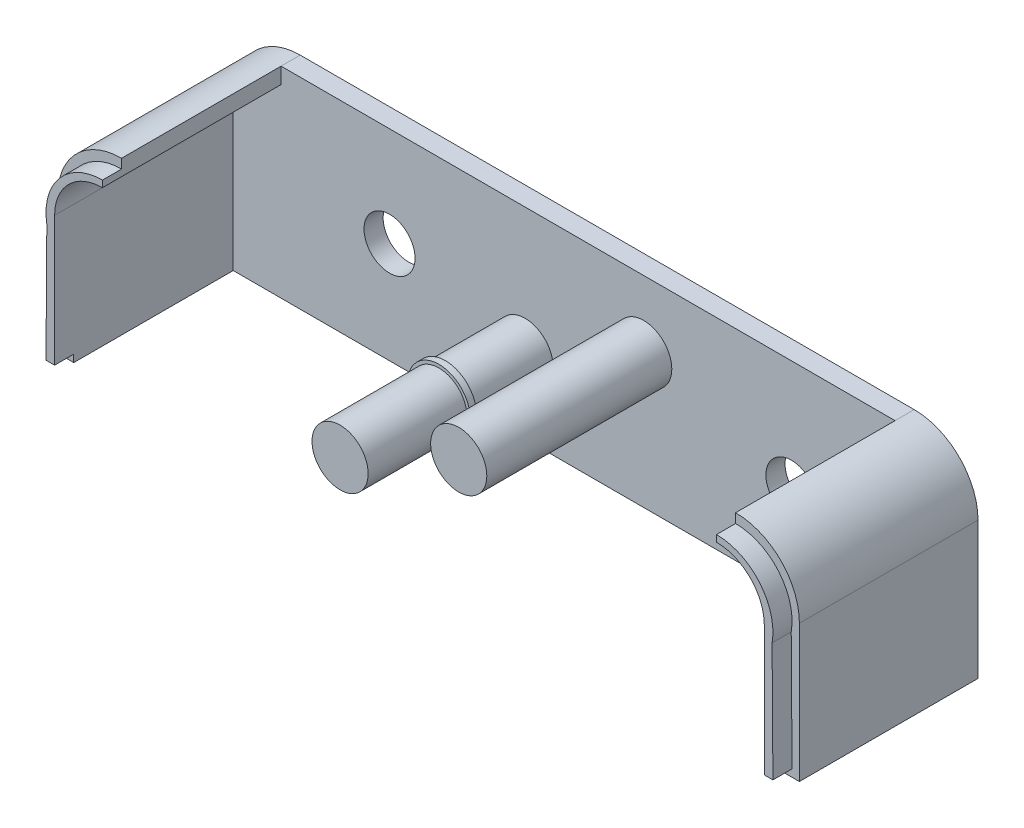
ISO-10303-21;
HEADER;
FILE_DESCRIPTION(('STEP AP214'),'2;1');
FILE_NAME('part.step','',(''),(''),'','','');
FILE_SCHEMA(('AUTOMOTIVE_DESIGN { 1 0 10303 214 1 1 1 1 }'));
ENDSEC;
DATA;
#1=APPLICATION_CONTEXT('core data for automotive mechanical design processes');
#2=APPLICATION_PROTOCOL_DEFINITION('international standard','automotive_design',2000,#1);
#3=PRODUCT_CONTEXT('',#1,'mechanical');
#4=PRODUCT('Part','Part','',(#3));
#5=PRODUCT_RELATED_PRODUCT_CATEGORY('part','',(#4));
#6=PRODUCT_DEFINITION_FORMATION('','',#4);
#7=PRODUCT_DEFINITION_CONTEXT('part definition',#1,'design');
#8=PRODUCT_DEFINITION('design','',#6,#7);
#9=PRODUCT_DEFINITION_SHAPE('','',#8);
#10=(LENGTH_UNIT() NAMED_UNIT(*) SI_UNIT(.MILLI.,.METRE.));
#11=(NAMED_UNIT(*) PLANE_ANGLE_UNIT() SI_UNIT($,.RADIAN.));
#12=(NAMED_UNIT(*) SI_UNIT($,.STERADIAN.) SOLID_ANGLE_UNIT());
#13=UNCERTAINTY_MEASURE_WITH_UNIT(LENGTH_MEASURE(1.E-05),#10,'distance_accuracy_value','');
#14=(GEOMETRIC_REPRESENTATION_CONTEXT(3) GLOBAL_UNCERTAINTY_ASSIGNED_CONTEXT((#13)) GLOBAL_UNIT_ASSIGNED_CONTEXT((#10,
#11,#12)) REPRESENTATION_CONTEXT('',''));
#15=CARTESIAN_POINT('',(0.,0.,0.));
#16=DIRECTION('',(0.,0.,1.));
#17=DIRECTION('',(1.,0.,0.));
#18=AXIS2_PLACEMENT_3D('',#15,#16,#17);
#19=CARTESIAN_POINT('',(-9.87500000000002,-3.75,28.));
#20=DIRECTION('',(0.,0.,-1.));
#21=DIRECTION('',(-1.,0.,0.));
#22=AXIS2_PLACEMENT_3D('',#19,#20,#21);
#23=CYLINDRICAL_SURFACE('',#22,4.4);
#24=CARTESIAN_POINT('',(-9.87500000000002,-3.75,3.));
#25=DIRECTION('',(0.,0.,1.));
#26=DIRECTION('',(1.,0.,0.));
#27=AXIS2_PLACEMENT_3D('',#24,#25,#26);
#28=CIRCLE('',#27,4.4);
#29=CARTESIAN_POINT('',(-5.47500000000002,-3.75,3.));
#30=VERTEX_POINT('',#29);
#31=EDGE_CURVE('E269',#30,#30,#28,.T.);
#32=ORIENTED_EDGE('',*,*,#31,.T.);
#33=EDGE_LOOP('',(#32));
#34=FACE_BOUND('',#33,.T.);
#35=CARTESIAN_POINT('',(-9.87500000000002,-3.75,15.5));
#36=DIRECTION('',(0.,0.,1.));
#37=DIRECTION('',(1.,0.,0.));
#38=AXIS2_PLACEMENT_3D('',#35,#36,#37);
#39=CIRCLE('',#38,4.4);
#40=CARTESIAN_POINT('',(-5.47500000000002,-3.75,15.5));
#41=VERTEX_POINT('',#40);
#42=EDGE_CURVE('E11',#41,#41,#39,.T.);
#43=ORIENTED_EDGE('',*,*,#42,.F.);
#44=EDGE_LOOP('',(#43));
#45=FACE_BOUND('',#44,.T.);
#46=ADVANCED_FACE('F43',(#34,#45),#23,.T.);
#47=CARTESIAN_POINT('',(0.,0.,28.));
#48=DIRECTION('',(0.,0.,1.));
#49=DIRECTION('',(1.,0.,0.));
#50=AXIS2_PLACEMENT_3D('',#47,#48,#49);
#51=PLANE('',#50);
#52=DIRECTION('',(-0.00691231713860875,0.999976109650513,0.));
#53=VECTOR('',#52,1.);
#54=CARTESIAN_POINT('',(56.8468788897479,3.93474700667868,28.));
#55=LINE('',#54,#53);
#56=CARTESIAN_POINT('',(56.975,-14.6,28.));
#57=VERTEX_POINT('',#56);
#58=CARTESIAN_POINT('',(56.8468788897479,3.93474700667868,28.));
#59=VERTEX_POINT('',#58);
#60=EDGE_CURVE('E253',#57,#59,#55,.T.);
#61=ORIENTED_EDGE('',*,*,#60,.F.);
#62=DIRECTION('',(1.,0.,0.));
#63=VECTOR('',#62,1.);
#64=CARTESIAN_POINT('',(55.625,-14.6,28.));
#65=LINE('',#64,#63);
#66=CARTESIAN_POINT('',(55.625,-14.6,28.));
#67=VERTEX_POINT('',#66);
#68=EDGE_CURVE('E230',#67,#57,#65,.T.);
#69=ORIENTED_EDGE('',*,*,#68,.F.);
#70=DIRECTION('',(0.,1.,0.));
#71=VECTOR('',#70,1.);
#72=CARTESIAN_POINT('',(55.625,0.,28.));
#73=LINE('',#72,#71);
#74=CARTESIAN_POINT('',(55.625,-15.75,28.));
#75=VERTEX_POINT('',#74);
#76=EDGE_CURVE('E274',#75,#67,#73,.T.);
#77=ORIENTED_EDGE('',*,*,#76,.F.);
#78=DIRECTION('',(1.,0.,0.));
#79=VECTOR('',#78,1.);
#80=CARTESIAN_POINT('',(0.,-15.75,28.));
#81=LINE('',#80,#79);
#82=CARTESIAN_POINT('',(58.125,-15.75,28.));
#83=VERTEX_POINT('',#82);
#84=EDGE_CURVE('E277',#75,#83,#81,.T.);
#85=ORIENTED_EDGE('',*,*,#84,.T.);
#86=DIRECTION('',(0.,1.,0.));
#87=VECTOR('',#86,1.);
#88=CARTESIAN_POINT('',(58.125,0.,28.));
#89=LINE('',#88,#87);
#90=CARTESIAN_POINT('',(58.125,5.75,28.));
#91=VERTEX_POINT('',#90);
#92=EDGE_CURVE('E281',#83,#91,#89,.T.);
#93=ORIENTED_EDGE('',*,*,#92,.T.);
#94=CARTESIAN_POINT('',(48.125,5.75,28.));
#95=DIRECTION('',(0.,0.,1.));
#96=DIRECTION('',(1.,0.,0.));
#97=AXIS2_PLACEMENT_3D('',#94,#95,#96);
#98=CIRCLE('',#97,10.);
#99=CARTESIAN_POINT('',(48.125,15.75,28.));
#100=VERTEX_POINT('',#99);
#101=EDGE_CURVE('E284',#91,#100,#98,.T.);
#102=ORIENTED_EDGE('',*,*,#101,.T.);
#103=DIRECTION('',(0.,1.,0.));
#104=VECTOR('',#103,1.);
#105=CARTESIAN_POINT('',(48.125,0.,28.));
#106=LINE('',#105,#104);
#107=CARTESIAN_POINT('',(48.125,14.2851898188413,28.));
#108=VERTEX_POINT('',#107);
#109=EDGE_CURVE('E287',#108,#100,#106,.T.);
#110=ORIENTED_EDGE('',*,*,#109,.F.);
#111=CARTESIAN_POINT('',(48.125,5.43518981884131,28.));
#112=DIRECTION('',(0.,0.,1.));
#113=DIRECTION('',(-1.,0.,0.));
#114=AXIS2_PLACEMENT_3D('',#111,#112,#113);
#115=CIRCLE('',#114,8.85);
#116=EDGE_CURVE('E251',#59,#108,#115,.T.);
#117=ORIENTED_EDGE('',*,*,#116,.F.);
#118=EDGE_LOOP('',(#61,#69,#77,#85,#93,#102,#110,#117));
#119=FACE_BOUND('',#118,.T.);
#120=ADVANCED_FACE('F409',(#119),#51,.T.);
#121=CARTESIAN_POINT('',(0.,0.,28.));
#122=DIRECTION('',(0.,0.,1.));
#123=DIRECTION('',(1.,0.,0.));
#124=AXIS2_PLACEMENT_3D('',#121,#122,#123);
#125=PLANE('',#124);
#126=DIRECTION('',(-0.006912317138608,-0.999976109650513,0.));
#127=VECTOR('',#126,1.);
#128=CARTESIAN_POINT('',(-56.8468788897479,3.93474700667866,28.));
#129=LINE('',#128,#127);
#130=CARTESIAN_POINT('',(-56.8468788897479,3.93474700667866,28.));
#131=VERTEX_POINT('',#130);
#132=CARTESIAN_POINT('',(-56.975,-14.6,28.));
#133=VERTEX_POINT('',#132);
#134=EDGE_CURVE('E216',#131,#133,#129,.T.);
#135=ORIENTED_EDGE('',*,*,#134,.F.);
#136=CARTESIAN_POINT('',(-48.125,5.4351898188413,28.));
#137=DIRECTION('',(0.,0.,1.));
#138=DIRECTION('',(1.,0.,0.));
#139=AXIS2_PLACEMENT_3D('',#136,#137,#138);
#140=CIRCLE('',#139,8.85);
#141=CARTESIAN_POINT('',(-48.125,14.2851898188413,28.));
#142=VERTEX_POINT('',#141);
#143=EDGE_CURVE('E228',#142,#131,#140,.T.);
#144=ORIENTED_EDGE('',*,*,#143,.F.);
#145=DIRECTION('',(0.,1.,0.));
#146=VECTOR('',#145,1.);
#147=CARTESIAN_POINT('',(-48.125,0.,28.));
#148=LINE('',#147,#146);
#149=CARTESIAN_POINT('',(-48.125,15.75,28.));
#150=VERTEX_POINT('',#149);
#151=EDGE_CURVE('E304',#142,#150,#148,.T.);
#152=ORIENTED_EDGE('',*,*,#151,.T.);
#153=CARTESIAN_POINT('',(-48.125,5.75,28.));
#154=DIRECTION('',(0.,0.,1.));
#155=DIRECTION('',(1.,0.,0.));
#156=AXIS2_PLACEMENT_3D('',#153,#154,#155);
#157=CIRCLE('',#156,10.);
#158=CARTESIAN_POINT('',(-58.125,5.75,28.));
#159=VERTEX_POINT('',#158);
#160=EDGE_CURVE('E306',#150,#159,#157,.T.);
#161=ORIENTED_EDGE('',*,*,#160,.T.);
#162=DIRECTION('',(0.,-1.,0.));
#163=VECTOR('',#162,1.);
#164=CARTESIAN_POINT('',(-58.125,0.,28.));
#165=LINE('',#164,#163);
#166=CARTESIAN_POINT('',(-58.125,-15.75,28.));
#167=VERTEX_POINT('',#166);
#168=EDGE_CURVE('E310',#159,#167,#165,.T.);
#169=ORIENTED_EDGE('',*,*,#168,.T.);
#170=DIRECTION('',(1.,0.,0.));
#171=VECTOR('',#170,1.);
#172=CARTESIAN_POINT('',(0.,-15.75,28.));
#173=LINE('',#172,#171);
#174=CARTESIAN_POINT('',(-55.625,-15.75,28.));
#175=VERTEX_POINT('',#174);
#176=EDGE_CURVE('E313',#167,#175,#173,.T.);
#177=ORIENTED_EDGE('',*,*,#176,.T.);
#178=DIRECTION('',(0.,-1.,0.));
#179=VECTOR('',#178,1.);
#180=CARTESIAN_POINT('',(-55.625,0.,28.));
#181=LINE('',#180,#179);
#182=CARTESIAN_POINT('',(-55.625,-14.6,28.));
#183=VERTEX_POINT('',#182);
#184=EDGE_CURVE('E316',#183,#175,#181,.T.);
#185=ORIENTED_EDGE('',*,*,#184,.F.);
#186=DIRECTION('',(1.,0.,0.));
#187=VECTOR('',#186,1.);
#188=CARTESIAN_POINT('',(-55.625,-14.6,28.));
#189=LINE('',#188,#187);
#190=EDGE_CURVE('E214',#133,#183,#189,.T.);
#191=ORIENTED_EDGE('',*,*,#190,.F.);
#192=EDGE_LOOP('',(#135,#144,#152,#161,#169,#177,#185,#191));
#193=FACE_BOUND('',#192,.T.);
#194=ADVANCED_FACE('F424',(#193),#125,.T.);
#195=CARTESIAN_POINT('',(8.72499999999998,5.25,28.));
#196=DIRECTION('',(0.,0.,-1.));
#197=DIRECTION('',(-1.,0.,0.));
#198=AXIS2_PLACEMENT_3D('',#195,#196,#197);
#199=CYLINDRICAL_SURFACE('',#198,4.39999999999999);
#200=CARTESIAN_POINT('',(8.72499999999998,5.25,3.));
#201=DIRECTION('',(0.,0.,1.));
#202=DIRECTION('',(1.,0.,0.));
#203=AXIS2_PLACEMENT_3D('',#200,#201,#202);
#204=CIRCLE('',#203,4.39999999999999);
#205=CARTESIAN_POINT('',(13.125,5.25,3.));
#206=VERTEX_POINT('',#205);
#207=EDGE_CURVE('E272',#206,#206,#204,.T.);
#208=ORIENTED_EDGE('',*,*,#207,.T.);
#209=EDGE_LOOP('',(#208));
#210=FACE_BOUND('',#209,.T.);
#211=CARTESIAN_POINT('',(8.72499999999998,5.25,32.));
#212=DIRECTION('',(0.,0.,1.));
#213=DIRECTION('',(1.,0.,0.));
#214=AXIS2_PLACEMENT_3D('',#211,#212,#213);
#215=CIRCLE('',#214,4.39999999999999);
#216=CARTESIAN_POINT('',(13.125,5.25,32.));
#217=VERTEX_POINT('',#216);
#218=EDGE_CURVE('E219',#217,#217,#215,.T.);
#219=ORIENTED_EDGE('',*,*,#218,.F.);
#220=EDGE_LOOP('',(#219));
#221=FACE_BOUND('',#220,.T.);
#222=ADVANCED_FACE('F540',(#210,#221),#199,.T.);
#223=CARTESIAN_POINT('',(-48.125,5.75,3.));
#224=DIRECTION('',(0.,0.,1.));
#225=DIRECTION('',(1.,0.,0.));
#226=AXIS2_PLACEMENT_3D('',#223,#224,#225);
#227=PLANE('',#226);
#228=ORIENTED_EDGE('',*,*,#31,.F.);
#229=EDGE_LOOP('',(#228));
#230=FACE_BOUND('',#229,.T.);
#231=ORIENTED_EDGE('',*,*,#207,.F.);
#232=EDGE_LOOP('',(#231));
#233=FACE_BOUND('',#232,.T.);
#234=CARTESIAN_POINT('',(31.875,-1.75,3.));
#235=DIRECTION('',(0.,0.,1.));
#236=DIRECTION('',(1.,0.,0.));
#237=AXIS2_PLACEMENT_3D('',#234,#235,#236);
#238=CIRCLE('',#237,4.00000000000001);
#239=CARTESIAN_POINT('',(35.875,-1.75,3.));
#240=VERTEX_POINT('',#239);
#241=EDGE_CURVE('E338',#240,#240,#238,.T.);
#242=ORIENTED_EDGE('',*,*,#241,.F.);
#243=EDGE_LOOP('',(#242));
#244=FACE_BOUND('',#243,.T.);
#245=CARTESIAN_POINT('',(-48.125,5.75,3.));
#246=DIRECTION('',(0.,0.,1.));
#247=DIRECTION('',(1.,0.,0.));
#248=AXIS2_PLACEMENT_3D('',#245,#246,#247);
#249=CIRCLE('',#248,7.5);
#250=CARTESIAN_POINT('',(-48.125,13.25,3.));
#251=VERTEX_POINT('',#250);
#252=CARTESIAN_POINT('',(-55.625,5.75,3.));
#253=VERTEX_POINT('',#252);
#254=EDGE_CURVE('E196',#251,#253,#249,.T.);
#255=ORIENTED_EDGE('',*,*,#254,.T.);
#256=DIRECTION('',(0.,-1.,0.));
#257=VECTOR('',#256,1.);
#258=CARTESIAN_POINT('',(-55.625,0.,3.));
#259=LINE('',#258,#257);
#260=CARTESIAN_POINT('',(-55.625,-15.75,3.));
#261=VERTEX_POINT('',#260);
#262=EDGE_CURVE('E307',#253,#261,#259,.T.);
#263=ORIENTED_EDGE('',*,*,#262,.T.);
#264=DIRECTION('',(1.,0.,0.));
#265=VECTOR('',#264,1.);
#266=CARTESIAN_POINT('',(-58.125,-15.75,3.));
#267=LINE('',#266,#265);
#268=CARTESIAN_POINT('',(55.625,-15.75,3.));
#269=VERTEX_POINT('',#268);
#270=EDGE_CURVE('E347',#261,#269,#267,.T.);
#271=ORIENTED_EDGE('',*,*,#270,.T.);
#272=DIRECTION('',(0.,1.,0.));
#273=VECTOR('',#272,1.);
#274=CARTESIAN_POINT('',(55.625,0.,3.));
#275=LINE('',#274,#273);
#276=CARTESIAN_POINT('',(55.625,5.75,3.));
#277=VERTEX_POINT('',#276);
#278=EDGE_CURVE('E292',#269,#277,#275,.T.);
#279=ORIENTED_EDGE('',*,*,#278,.T.);
#280=CARTESIAN_POINT('',(48.125,5.75,3.));
#281=DIRECTION('',(0.,0.,1.));
#282=DIRECTION('',(1.,0.,0.));
#283=AXIS2_PLACEMENT_3D('',#280,#281,#282);
#284=CIRCLE('',#283,7.5);
#285=CARTESIAN_POINT('',(48.125,13.25,3.));
#286=VERTEX_POINT('',#285);
#287=EDGE_CURVE('E199',#277,#286,#284,.T.);
#288=ORIENTED_EDGE('',*,*,#287,.T.);
#289=DIRECTION('',(0.,1.,0.));
#290=VECTOR('',#289,1.);
#291=CARTESIAN_POINT('',(48.125,0.,3.));
#292=LINE('',#291,#290);
#293=CARTESIAN_POINT('',(48.125,15.75,3.));
#294=VERTEX_POINT('',#293);
#295=EDGE_CURVE('E278',#286,#294,#292,.T.);
#296=ORIENTED_EDGE('',*,*,#295,.T.);
#297=DIRECTION('',(-1.,0.,0.));
#298=VECTOR('',#297,1.);
#299=CARTESIAN_POINT('',(-48.125,15.75,3.));
#300=LINE('',#299,#298);
#301=CARTESIAN_POINT('',(-48.125,15.75,3.));
#302=VERTEX_POINT('',#301);
#303=EDGE_CURVE('E344',#294,#302,#300,.T.);
#304=ORIENTED_EDGE('',*,*,#303,.T.);
#305=DIRECTION('',(0.,1.,0.));
#306=VECTOR('',#305,1.);
#307=CARTESIAN_POINT('',(-48.125,0.,3.));
#308=LINE('',#307,#306);
#309=EDGE_CURVE('E320',#251,#302,#308,.T.);
#310=ORIENTED_EDGE('',*,*,#309,.F.);
#311=EDGE_LOOP('',(#255,#263,#271,#279,#288,#296,#304,#310));
#312=FACE_BOUND('',#311,.T.);
#313=CARTESIAN_POINT('',(-31.125,0.150000000000001,3.));
#314=DIRECTION('',(0.,0.,1.));
#315=DIRECTION('',(1.,0.,0.));
#316=AXIS2_PLACEMENT_3D('',#313,#314,#315);
#317=CIRCLE('',#316,4.);
#318=CARTESIAN_POINT('',(-27.125,0.150000000000001,3.));
#319=VERTEX_POINT('',#318);
#320=EDGE_CURVE('E332',#319,#319,#317,.T.);
#321=ORIENTED_EDGE('',*,*,#320,.F.);
#322=EDGE_LOOP('',(#321));
#323=FACE_BOUND('',#322,.T.);
#324=ADVANCED_FACE('F401',(#230,#233,#244,#312,#323),#227,.T.);
#325=CARTESIAN_POINT('',(-48.125,5.75,0.));
#326=DIRECTION('',(0.,0.,1.));
#327=DIRECTION('',(1.,0.,0.));
#328=AXIS2_PLACEMENT_3D('',#325,#326,#327);
#329=PLANE('',#328);
#330=DIRECTION('',(0.,1.,0.));
#331=VECTOR('',#330,1.);
#332=CARTESIAN_POINT('',(58.125,5.75,0.));
#333=LINE('',#332,#331);
#334=CARTESIAN_POINT('',(58.125,-15.75,0.));
#335=VERTEX_POINT('',#334);
#336=CARTESIAN_POINT('',(58.125,5.75,0.));
#337=VERTEX_POINT('',#336);
#338=EDGE_CURVE('E341',#335,#337,#333,.T.);
#339=ORIENTED_EDGE('',*,*,#338,.F.);
#340=DIRECTION('',(1.,0.,0.));
#341=VECTOR('',#340,1.);
#342=CARTESIAN_POINT('',(-58.125,-15.75,0.));
#343=LINE('',#342,#341);
#344=CARTESIAN_POINT('',(-58.125,-15.75,0.));
#345=VERTEX_POINT('',#344);
#346=EDGE_CURVE('E348',#345,#335,#343,.T.);
#347=ORIENTED_EDGE('',*,*,#346,.F.);
#348=DIRECTION('',(0.,-1.,0.));
#349=VECTOR('',#348,1.);
#350=CARTESIAN_POINT('',(-58.125,5.75,0.));
#351=LINE('',#350,#349);
#352=CARTESIAN_POINT('',(-58.125,5.75,0.));
#353=VERTEX_POINT('',#352);
#354=EDGE_CURVE('E360',#353,#345,#351,.T.);
#355=ORIENTED_EDGE('',*,*,#354,.F.);
#356=CARTESIAN_POINT('',(-48.125,5.75,0.));
#357=DIRECTION('',(0.,0.,1.));
#358=DIRECTION('',(1.,0.,0.));
#359=AXIS2_PLACEMENT_3D('',#356,#357,#358);
#360=CIRCLE('',#359,10.);
#361=CARTESIAN_POINT('',(-48.125,15.75,0.));
#362=VERTEX_POINT('',#361);
#363=EDGE_CURVE('E358',#362,#353,#360,.T.);
#364=ORIENTED_EDGE('',*,*,#363,.F.);
#365=DIRECTION('',(-1.,0.,0.));
#366=VECTOR('',#365,1.);
#367=CARTESIAN_POINT('',(-48.125,15.75,0.));
#368=LINE('',#367,#366);
#369=CARTESIAN_POINT('',(48.125,15.75,0.));
#370=VERTEX_POINT('',#369);
#371=EDGE_CURVE('E356',#370,#362,#368,.T.);
#372=ORIENTED_EDGE('',*,*,#371,.F.);
#373=CARTESIAN_POINT('',(48.125,5.75,0.));
#374=DIRECTION('',(0.,0.,1.));
#375=DIRECTION('',(-1.,0.,0.));
#376=AXIS2_PLACEMENT_3D('',#373,#374,#375);
#377=CIRCLE('',#376,10.);
#378=EDGE_CURVE('E354',#337,#370,#377,.T.);
#379=ORIENTED_EDGE('',*,*,#378,.F.);
#380=EDGE_LOOP('',(#339,#347,#355,#364,#372,#379));
#381=FACE_BOUND('',#380,.T.);
#382=CARTESIAN_POINT('',(31.875,-1.75,0.));
#383=DIRECTION('',(0.,0.,1.));
#384=DIRECTION('',(1.,0.,0.));
#385=AXIS2_PLACEMENT_3D('',#382,#383,#384);
#386=CIRCLE('',#385,4.00000000000001);
#387=CARTESIAN_POINT('',(35.875,-1.75,0.));
#388=VERTEX_POINT('',#387);
#389=EDGE_CURVE('E335',#388,#388,#386,.T.);
#390=ORIENTED_EDGE('',*,*,#389,.T.);
#391=EDGE_LOOP('',(#390));
#392=FACE_BOUND('',#391,.T.);
#393=CARTESIAN_POINT('',(-31.125,0.150000000000001,0.));
#394=DIRECTION('',(0.,0.,1.));
#395=DIRECTION('',(1.,0.,0.));
#396=AXIS2_PLACEMENT_3D('',#393,#394,#395);
#397=CIRCLE('',#396,4.);
#398=CARTESIAN_POINT('',(-27.125,0.150000000000001,0.));
#399=VERTEX_POINT('',#398);
#400=EDGE_CURVE('E331',#399,#399,#397,.T.);
#401=ORIENTED_EDGE('',*,*,#400,.T.);
#402=EDGE_LOOP('',(#401));
#403=FACE_BOUND('',#402,.T.);
#404=ADVANCED_FACE('F388',(#381,#392,#403),#329,.F.);
#405=CARTESIAN_POINT('',(58.125,5.75,3.));
#406=DIRECTION('',(-1.,0.,0.));
#407=DIRECTION('',(0.,-1.,0.));
#408=AXIS2_PLACEMENT_3D('',#405,#406,#407);
#409=PLANE('',#408);
#410=ORIENTED_EDGE('',*,*,#338,.T.);
#411=DIRECTION('',(0.,0.,-1.));
#412=VECTOR('',#411,1.);
#413=CARTESIAN_POINT('',(58.125,5.75,3.));
#414=LINE('',#413,#412);
#415=EDGE_CURVE('E52',#91,#337,#414,.T.);
#416=ORIENTED_EDGE('',*,*,#415,.F.);
#417=ORIENTED_EDGE('',*,*,#92,.F.);
#418=DIRECTION('',(0.,0.,-1.));
#419=VECTOR('',#418,1.);
#420=CARTESIAN_POINT('',(58.125,-15.75,3.));
#421=LINE('',#420,#419);
#422=EDGE_CURVE('E351',#83,#335,#421,.T.);
#423=ORIENTED_EDGE('',*,*,#422,.T.);
#424=EDGE_LOOP('',(#410,#416,#417,#423));
#425=FACE_BOUND('',#424,.T.);
#426=ADVANCED_FACE('F45',(#425),#409,.F.);
#427=CARTESIAN_POINT('',(48.125,5.75,3.));
#428=DIRECTION('',(0.,0.,-1.));
#429=DIRECTION('',(-1.,0.,0.));
#430=AXIS2_PLACEMENT_3D('',#427,#428,#429);
#431=CYLINDRICAL_SURFACE('',#430,10.);
#432=ORIENTED_EDGE('',*,*,#378,.T.);
#433=DIRECTION('',(0.,0.,-1.));
#434=VECTOR('',#433,1.);
#435=CARTESIAN_POINT('',(48.125,15.75,3.));
#436=LINE('',#435,#434);
#437=EDGE_CURVE('E374',#294,#370,#436,.T.);
#438=ORIENTED_EDGE('',*,*,#437,.F.);
#439=DIRECTION('',(0.,0.,-1.));
#440=VECTOR('',#439,1.);
#441=CARTESIAN_POINT('',(48.125,15.75,28.));
#442=LINE('',#441,#440);
#443=EDGE_CURVE('E298',#100,#294,#442,.T.);
#444=ORIENTED_EDGE('',*,*,#443,.F.);
#445=ORIENTED_EDGE('',*,*,#101,.F.);
#446=ORIENTED_EDGE('',*,*,#415,.T.);
#447=EDGE_LOOP('',(#432,#438,#444,#445,#446));
#448=FACE_BOUND('',#447,.T.);
#449=ADVANCED_FACE('F380',(#448),#431,.T.);
#450=CARTESIAN_POINT('',(-48.125,15.75,3.));
#451=DIRECTION('',(0.,-1.,0.));
#452=DIRECTION('',(1.,0.,0.));
#453=AXIS2_PLACEMENT_3D('',#450,#451,#452);
#454=PLANE('',#453);
#455=ORIENTED_EDGE('',*,*,#371,.T.);
#456=DIRECTION('',(0.,0.,-1.));
#457=VECTOR('',#456,1.);
#458=CARTESIAN_POINT('',(-48.125,15.75,3.));
#459=LINE('',#458,#457);
#460=EDGE_CURVE('E371',#302,#362,#459,.T.);
#461=ORIENTED_EDGE('',*,*,#460,.F.);
#462=ORIENTED_EDGE('',*,*,#303,.F.);
#463=ORIENTED_EDGE('',*,*,#437,.T.);
#464=EDGE_LOOP('',(#455,#461,#462,#463));
#465=FACE_BOUND('',#464,.T.);
#466=ADVANCED_FACE('F394',(#465),#454,.F.);
#467=CARTESIAN_POINT('',(-48.125,5.75,3.));
#468=DIRECTION('',(0.,0.,-1.));
#469=DIRECTION('',(-1.,0.,0.));
#470=AXIS2_PLACEMENT_3D('',#467,#468,#469);
#471=CYLINDRICAL_SURFACE('',#470,10.);
#472=ORIENTED_EDGE('',*,*,#363,.T.);
#473=DIRECTION('',(0.,0.,-1.));
#474=VECTOR('',#473,1.);
#475=CARTESIAN_POINT('',(-58.125,5.75,3.));
#476=LINE('',#475,#474);
#477=EDGE_CURVE('E368',#159,#353,#476,.T.);
#478=ORIENTED_EDGE('',*,*,#477,.F.);
#479=ORIENTED_EDGE('',*,*,#160,.F.);
#480=DIRECTION('',(0.,0.,-1.));
#481=VECTOR('',#480,1.);
#482=CARTESIAN_POINT('',(-48.125,15.75,28.));
#483=LINE('',#482,#481);
#484=EDGE_CURVE('E200',#150,#302,#483,.T.);
#485=ORIENTED_EDGE('',*,*,#484,.T.);
#486=ORIENTED_EDGE('',*,*,#460,.T.);
#487=EDGE_LOOP('',(#472,#478,#479,#485,#486));
#488=FACE_BOUND('',#487,.T.);
#489=ADVANCED_FACE('F397',(#488),#471,.T.);
#490=CARTESIAN_POINT('',(-58.125,5.75,3.));
#491=DIRECTION('',(1.,0.,0.));
#492=DIRECTION('',(0.,0.,-1.));
#493=AXIS2_PLACEMENT_3D('',#490,#491,#492);
#494=PLANE('',#493);
#495=ORIENTED_EDGE('',*,*,#354,.T.);
#496=DIRECTION('',(0.,0.,-1.));
#497=VECTOR('',#496,1.);
#498=CARTESIAN_POINT('',(-58.125,-15.75,3.));
#499=LINE('',#498,#497);
#500=EDGE_CURVE('E365',#167,#345,#499,.T.);
#501=ORIENTED_EDGE('',*,*,#500,.F.);
#502=ORIENTED_EDGE('',*,*,#168,.F.);
#503=ORIENTED_EDGE('',*,*,#477,.T.);
#504=EDGE_LOOP('',(#495,#501,#502,#503));
#505=FACE_BOUND('',#504,.T.);
#506=ADVANCED_FACE('F421',(#505),#494,.F.);
#507=CARTESIAN_POINT('',(-58.125,-15.75,3.));
#508=DIRECTION('',(0.,1.,0.));
#509=DIRECTION('',(0.,0.,1.));
#510=AXIS2_PLACEMENT_3D('',#507,#508,#509);
#511=PLANE('',#510);
#512=ORIENTED_EDGE('',*,*,#346,.T.);
#513=ORIENTED_EDGE('',*,*,#422,.F.);
#514=ORIENTED_EDGE('',*,*,#84,.F.);
#515=DIRECTION('',(0.,0.,-1.));
#516=VECTOR('',#515,1.);
#517=CARTESIAN_POINT('',(55.625,-15.75,28.));
#518=LINE('',#517,#516);
#519=EDGE_CURVE('E300',#75,#269,#518,.T.);
#520=ORIENTED_EDGE('',*,*,#519,.T.);
#521=ORIENTED_EDGE('',*,*,#270,.F.);
#522=DIRECTION('',(0.,0.,-1.));
#523=VECTOR('',#522,1.);
#524=CARTESIAN_POINT('',(-55.625,-15.75,28.));
#525=LINE('',#524,#523);
#526=EDGE_CURVE('E324',#175,#261,#525,.T.);
#527=ORIENTED_EDGE('',*,*,#526,.F.);
#528=ORIENTED_EDGE('',*,*,#176,.F.);
#529=ORIENTED_EDGE('',*,*,#500,.T.);
#530=EDGE_LOOP('',(#512,#513,#514,#520,#521,#527,#528,#529));
#531=FACE_BOUND('',#530,.T.);
#532=ADVANCED_FACE('F414',(#531),#511,.F.);
#533=CARTESIAN_POINT('',(31.875,-1.75,3.));
#534=DIRECTION('',(0.,0.,-1.));
#535=DIRECTION('',(-1.,0.,0.));
#536=AXIS2_PLACEMENT_3D('',#533,#534,#535);
#537=CYLINDRICAL_SURFACE('',#536,4.00000000000001);
#538=ORIENTED_EDGE('',*,*,#241,.T.);
#539=EDGE_LOOP('',(#538));
#540=FACE_BOUND('',#539,.T.);
#541=ORIENTED_EDGE('',*,*,#389,.F.);
#542=EDGE_LOOP('',(#541));
#543=FACE_BOUND('',#542,.T.);
#544=ADVANCED_FACE('F547',(#540,#543),#537,.F.);
#545=CARTESIAN_POINT('',(-31.125,0.150000000000001,3.));
#546=DIRECTION('',(0.,0.,-1.));
#547=DIRECTION('',(-1.,0.,0.));
#548=AXIS2_PLACEMENT_3D('',#545,#546,#547);
#549=CYLINDRICAL_SURFACE('',#548,4.);
#550=ORIENTED_EDGE('',*,*,#320,.T.);
#551=EDGE_LOOP('',(#550));
#552=FACE_BOUND('',#551,.T.);
#553=ORIENTED_EDGE('',*,*,#400,.F.);
#554=EDGE_LOOP('',(#553));
#555=FACE_BOUND('',#554,.T.);
#556=ADVANCED_FACE('F544',(#552,#555),#549,.F.);
#557=CARTESIAN_POINT('',(48.125,5.75,28.));
#558=DIRECTION('',(0.,0.,-1.));
#559=DIRECTION('',(-1.,0.,0.));
#560=AXIS2_PLACEMENT_3D('',#557,#558,#559);
#561=CYLINDRICAL_SURFACE('',#560,7.5);
#562=ORIENTED_EDGE('',*,*,#287,.F.);
#563=DIRECTION('',(0.,0.,-1.));
#564=VECTOR('',#563,1.);
#565=CARTESIAN_POINT('',(55.625,5.75,28.));
#566=LINE('',#565,#564);
#567=CARTESIAN_POINT('',(55.625,5.75000000000001,31.));
#568=VERTEX_POINT('',#567);
#569=EDGE_CURVE('E273',#568,#277,#566,.T.);
#570=ORIENTED_EDGE('',*,*,#569,.F.);
#571=CARTESIAN_POINT('',(48.125,5.75000000000001,31.));
#572=DIRECTION('',(0.,0.,-1.));
#573=DIRECTION('',(-1.,0.,0.));
#574=AXIS2_PLACEMENT_3D('',#571,#572,#573);
#575=CIRCLE('',#574,7.5);
#576=CARTESIAN_POINT('',(48.125,13.25,31.));
#577=VERTEX_POINT('',#576);
#578=EDGE_CURVE('E254',#577,#568,#575,.T.);
#579=ORIENTED_EDGE('',*,*,#578,.F.);
#580=DIRECTION('',(0.,0.,-1.));
#581=VECTOR('',#580,1.);
#582=CARTESIAN_POINT('',(48.125,13.25,28.));
#583=LINE('',#582,#581);
#584=EDGE_CURVE('E289',#577,#286,#583,.T.);
#585=ORIENTED_EDGE('',*,*,#584,.T.);
#586=EDGE_LOOP('',(#562,#570,#579,#585));
#587=FACE_BOUND('',#586,.T.);
#588=ADVANCED_FACE('F446',(#587),#561,.F.);
#589=CARTESIAN_POINT('',(55.625,0.,28.));
#590=DIRECTION('',(-1.,0.,0.));
#591=DIRECTION('',(0.,-1.,0.));
#592=AXIS2_PLACEMENT_3D('',#589,#590,#591);
#593=PLANE('',#592);
#594=ORIENTED_EDGE('',*,*,#278,.F.);
#595=ORIENTED_EDGE('',*,*,#519,.F.);
#596=ORIENTED_EDGE('',*,*,#76,.T.);
#597=DIRECTION('',(0.,0.,-1.));
#598=VECTOR('',#597,1.);
#599=CARTESIAN_POINT('',(55.625,-14.6,31.));
#600=LINE('',#599,#598);
#601=CARTESIAN_POINT('',(55.625,-14.6,31.));
#602=VERTEX_POINT('',#601);
#603=EDGE_CURVE('E240',#602,#67,#600,.T.);
#604=ORIENTED_EDGE('',*,*,#603,.F.);
#605=DIRECTION('',(0.,-1.,0.));
#606=VECTOR('',#605,1.);
#607=CARTESIAN_POINT('',(55.625,-14.6,31.));
#608=LINE('',#607,#606);
#609=EDGE_CURVE('E265',#568,#602,#608,.T.);
#610=ORIENTED_EDGE('',*,*,#609,.F.);
#611=ORIENTED_EDGE('',*,*,#569,.T.);
#612=EDGE_LOOP('',(#594,#595,#596,#604,#610,#611));
#613=FACE_BOUND('',#612,.T.);
#614=ADVANCED_FACE('F441',(#613),#593,.T.);
#615=CARTESIAN_POINT('',(48.125,0.,28.));
#616=DIRECTION('',(-1.,0.,0.));
#617=DIRECTION('',(0.,0.,1.));
#618=AXIS2_PLACEMENT_3D('',#615,#616,#617);
#619=PLANE('',#618);
#620=ORIENTED_EDGE('',*,*,#295,.F.);
#621=ORIENTED_EDGE('',*,*,#584,.F.);
#622=DIRECTION('',(0.,-1.,0.));
#623=VECTOR('',#622,1.);
#624=CARTESIAN_POINT('',(48.125,13.25,31.));
#625=LINE('',#624,#623);
#626=CARTESIAN_POINT('',(48.125,14.2851898188413,31.));
#627=VERTEX_POINT('',#626);
#628=EDGE_CURVE('E250',#627,#577,#625,.T.);
#629=ORIENTED_EDGE('',*,*,#628,.F.);
#630=DIRECTION('',(0.,0.,-1.));
#631=VECTOR('',#630,1.);
#632=CARTESIAN_POINT('',(48.125,14.2851898188413,31.));
#633=LINE('',#632,#631);
#634=EDGE_CURVE('E59',#627,#108,#633,.T.);
#635=ORIENTED_EDGE('',*,*,#634,.T.);
#636=ORIENTED_EDGE('',*,*,#109,.T.);
#637=ORIENTED_EDGE('',*,*,#443,.T.);
#638=EDGE_LOOP('',(#620,#621,#629,#635,#636,#637));
#639=FACE_BOUND('',#638,.T.);
#640=ADVANCED_FACE('F404',(#639),#619,.T.);
#641=CARTESIAN_POINT('',(-48.125,5.75,28.));
#642=DIRECTION('',(0.,0.,-1.));
#643=DIRECTION('',(-1.,0.,0.));
#644=AXIS2_PLACEMENT_3D('',#641,#642,#643);
#645=CYLINDRICAL_SURFACE('',#644,7.5);
#646=ORIENTED_EDGE('',*,*,#254,.F.);
#647=DIRECTION('',(0.,0.,-1.));
#648=VECTOR('',#647,1.);
#649=CARTESIAN_POINT('',(-48.125,13.25,28.));
#650=LINE('',#649,#648);
#651=CARTESIAN_POINT('',(-48.125,13.25,31.));
#652=VERTEX_POINT('',#651);
#653=EDGE_CURVE('E190',#652,#251,#650,.T.);
#654=ORIENTED_EDGE('',*,*,#653,.F.);
#655=CARTESIAN_POINT('',(-48.125,5.75,31.));
#656=DIRECTION('',(0.,0.,-1.));
#657=DIRECTION('',(1.,0.,0.));
#658=AXIS2_PLACEMENT_3D('',#655,#656,#657);
#659=CIRCLE('',#658,7.5);
#660=CARTESIAN_POINT('',(-55.625,5.75,31.));
#661=VERTEX_POINT('',#660);
#662=EDGE_CURVE('E195',#661,#652,#659,.T.);
#663=ORIENTED_EDGE('',*,*,#662,.F.);
#664=DIRECTION('',(0.,0.,-1.));
#665=VECTOR('',#664,1.);
#666=CARTESIAN_POINT('',(-55.625,5.75,28.));
#667=LINE('',#666,#665);
#668=EDGE_CURVE('E318',#661,#253,#667,.T.);
#669=ORIENTED_EDGE('',*,*,#668,.T.);
#670=EDGE_LOOP('',(#646,#654,#663,#669));
#671=FACE_BOUND('',#670,.T.);
#672=ADVANCED_FACE('F192',(#671),#645,.F.);
#673=CARTESIAN_POINT('',(-48.125,0.,28.));
#674=DIRECTION('',(-1.,0.,0.));
#675=DIRECTION('',(0.,0.,1.));
#676=AXIS2_PLACEMENT_3D('',#673,#674,#675);
#677=PLANE('',#676);
#678=ORIENTED_EDGE('',*,*,#309,.T.);
#679=ORIENTED_EDGE('',*,*,#484,.F.);
#680=ORIENTED_EDGE('',*,*,#151,.F.);
#681=DIRECTION('',(0.,0.,-1.));
#682=VECTOR('',#681,1.);
#683=CARTESIAN_POINT('',(-48.125,14.2851898188413,31.));
#684=LINE('',#683,#682);
#685=CARTESIAN_POINT('',(-48.125,14.2851898188413,31.));
#686=VERTEX_POINT('',#685);
#687=EDGE_CURVE('E206',#686,#142,#684,.T.);
#688=ORIENTED_EDGE('',*,*,#687,.F.);
#689=DIRECTION('',(0.,1.,0.));
#690=VECTOR('',#689,1.);
#691=CARTESIAN_POINT('',(-48.125,13.25,31.));
#692=LINE('',#691,#690);
#693=EDGE_CURVE('E203',#652,#686,#692,.T.);
#694=ORIENTED_EDGE('',*,*,#693,.F.);
#695=ORIENTED_EDGE('',*,*,#653,.T.);
#696=EDGE_LOOP('',(#678,#679,#680,#688,#694,#695));
#697=FACE_BOUND('',#696,.T.);
#698=ADVANCED_FACE('F204',(#697),#677,.F.);
#699=CARTESIAN_POINT('',(-55.625,0.,28.));
#700=DIRECTION('',(1.,0.,0.));
#701=DIRECTION('',(0.,0.,-1.));
#702=AXIS2_PLACEMENT_3D('',#699,#700,#701);
#703=PLANE('',#702);
#704=ORIENTED_EDGE('',*,*,#262,.F.);
#705=ORIENTED_EDGE('',*,*,#668,.F.);
#706=DIRECTION('',(0.,1.,0.));
#707=VECTOR('',#706,1.);
#708=CARTESIAN_POINT('',(-55.625,-14.6,31.));
#709=LINE('',#708,#707);
#710=CARTESIAN_POINT('',(-55.625,-14.6,31.));
#711=VERTEX_POINT('',#710);
#712=EDGE_CURVE('E213',#711,#661,#709,.T.);
#713=ORIENTED_EDGE('',*,*,#712,.F.);
#714=DIRECTION('',(0.,0.,-1.));
#715=VECTOR('',#714,1.);
#716=CARTESIAN_POINT('',(-55.625,-14.6,31.));
#717=LINE('',#716,#715);
#718=EDGE_CURVE('E67',#711,#183,#717,.T.);
#719=ORIENTED_EDGE('',*,*,#718,.T.);
#720=ORIENTED_EDGE('',*,*,#184,.T.);
#721=ORIENTED_EDGE('',*,*,#526,.T.);
#722=EDGE_LOOP('',(#704,#705,#713,#719,#720,#721));
#723=FACE_BOUND('',#722,.T.);
#724=ADVANCED_FACE('F439',(#723),#703,.T.);
#725=CARTESIAN_POINT('',(-48.125,5.4351898188413,31.));
#726=DIRECTION('',(0.,0.,-1.));
#727=DIRECTION('',(-1.,0.,0.));
#728=AXIS2_PLACEMENT_3D('',#725,#726,#727);
#729=CYLINDRICAL_SURFACE('',#728,8.85);
#730=ORIENTED_EDGE('',*,*,#143,.T.);
#731=DIRECTION('',(0.,0.,-1.));
#732=VECTOR('',#731,1.);
#733=CARTESIAN_POINT('',(-56.8468788897479,3.93474700667866,31.));
#734=LINE('',#733,#732);
#735=CARTESIAN_POINT('',(-56.8468788897479,3.93474700667866,31.));
#736=VERTEX_POINT('',#735);
#737=EDGE_CURVE('E236',#736,#131,#734,.T.);
#738=ORIENTED_EDGE('',*,*,#737,.F.);
#739=CARTESIAN_POINT('',(-48.125,5.4351898188413,31.));
#740=DIRECTION('',(0.,0.,1.));
#741=DIRECTION('',(1.,0.,0.));
#742=AXIS2_PLACEMENT_3D('',#739,#740,#741);
#743=CIRCLE('',#742,8.85);
#744=EDGE_CURVE('E209',#686,#736,#743,.T.);
#745=ORIENTED_EDGE('',*,*,#744,.F.);
#746=ORIENTED_EDGE('',*,*,#687,.T.);
#747=EDGE_LOOP('',(#730,#738,#745,#746));
#748=FACE_BOUND('',#747,.T.);
#749=ADVANCED_FACE('F430',(#748),#729,.T.);
#750=CARTESIAN_POINT('',(-56.8468788897479,3.93474700667866,31.));
#751=DIRECTION('',(0.999976109650513,-0.006912317138608,0.));
#752=DIRECTION('',(0.006912317138608,0.999976109650513,0.));
#753=AXIS2_PLACEMENT_3D('',#750,#751,#752);
#754=PLANE('',#753);
#755=ORIENTED_EDGE('',*,*,#134,.T.);
#756=DIRECTION('',(0.,0.,-1.));
#757=VECTOR('',#756,1.);
#758=CARTESIAN_POINT('',(-56.975,-14.6,31.));
#759=LINE('',#758,#757);
#760=CARTESIAN_POINT('',(-56.975,-14.6,31.));
#761=VERTEX_POINT('',#760);
#762=EDGE_CURVE('E233',#761,#133,#759,.T.);
#763=ORIENTED_EDGE('',*,*,#762,.F.);
#764=DIRECTION('',(-0.006912317138608,-0.999976109650513,0.));
#765=VECTOR('',#764,1.);
#766=CARTESIAN_POINT('',(-56.8468788897479,3.93474700667866,31.));
#767=LINE('',#766,#765);
#768=EDGE_CURVE('E223',#736,#761,#767,.T.);
#769=ORIENTED_EDGE('',*,*,#768,.F.);
#770=ORIENTED_EDGE('',*,*,#737,.T.);
#771=EDGE_LOOP('',(#755,#763,#769,#770));
#772=FACE_BOUND('',#771,.T.);
#773=ADVANCED_FACE('F433',(#772),#754,.F.);
#774=CARTESIAN_POINT('',(-55.625,-14.6,31.));
#775=DIRECTION('',(0.,1.,0.));
#776=DIRECTION('',(0.,0.,1.));
#777=AXIS2_PLACEMENT_3D('',#774,#775,#776);
#778=PLANE('',#777);
#779=ORIENTED_EDGE('',*,*,#190,.T.);
#780=ORIENTED_EDGE('',*,*,#718,.F.);
#781=DIRECTION('',(1.,0.,0.));
#782=VECTOR('',#781,1.);
#783=CARTESIAN_POINT('',(-55.625,-14.6,31.));
#784=LINE('',#783,#782);
#785=EDGE_CURVE('E225',#761,#711,#784,.T.);
#786=ORIENTED_EDGE('',*,*,#785,.F.);
#787=ORIENTED_EDGE('',*,*,#762,.T.);
#788=EDGE_LOOP('',(#779,#780,#786,#787));
#789=FACE_BOUND('',#788,.T.);
#790=ADVANCED_FACE('F437',(#789),#778,.F.);
#791=CARTESIAN_POINT('',(-48.125,5.75,31.));
#792=DIRECTION('',(0.,0.,1.));
#793=DIRECTION('',(1.,0.,0.));
#794=AXIS2_PLACEMENT_3D('',#791,#792,#793);
#795=PLANE('',#794);
#796=ORIENTED_EDGE('',*,*,#662,.T.);
#797=ORIENTED_EDGE('',*,*,#693,.T.);
#798=ORIENTED_EDGE('',*,*,#744,.T.);
#799=ORIENTED_EDGE('',*,*,#768,.T.);
#800=ORIENTED_EDGE('',*,*,#785,.T.);
#801=ORIENTED_EDGE('',*,*,#712,.T.);
#802=EDGE_LOOP('',(#796,#797,#798,#799,#800,#801));
#803=FACE_BOUND('',#802,.T.);
#804=ADVANCED_FACE('F212',(#803),#795,.T.);
#805=CARTESIAN_POINT('',(55.625,-14.6,31.));
#806=DIRECTION('',(0.,1.,0.));
#807=DIRECTION('',(0.,0.,1.));
#808=AXIS2_PLACEMENT_3D('',#805,#806,#807);
#809=PLANE('',#808);
#810=ORIENTED_EDGE('',*,*,#68,.T.);
#811=DIRECTION('',(0.,0.,-1.));
#812=VECTOR('',#811,1.);
#813=CARTESIAN_POINT('',(56.975,-14.6,31.));
#814=LINE('',#813,#812);
#815=CARTESIAN_POINT('',(56.975,-14.6,31.));
#816=VERTEX_POINT('',#815);
#817=EDGE_CURVE('E242',#816,#57,#814,.T.);
#818=ORIENTED_EDGE('',*,*,#817,.F.);
#819=DIRECTION('',(1.,0.,0.));
#820=VECTOR('',#819,1.);
#821=CARTESIAN_POINT('',(55.625,-14.6,31.));
#822=LINE('',#821,#820);
#823=EDGE_CURVE('E263',#602,#816,#822,.T.);
#824=ORIENTED_EDGE('',*,*,#823,.F.);
#825=ORIENTED_EDGE('',*,*,#603,.T.);
#826=EDGE_LOOP('',(#810,#818,#824,#825));
#827=FACE_BOUND('',#826,.T.);
#828=ADVANCED_FACE('F459',(#827),#809,.F.);
#829=CARTESIAN_POINT('',(56.8468788897479,3.93474700667868,31.));
#830=DIRECTION('',(-0.999976109650513,-0.00691231713860874,0.));
#831=DIRECTION('',(0.00691231713860875,-0.999976109650513,0.));
#832=AXIS2_PLACEMENT_3D('',#829,#830,#831);
#833=PLANE('',#832);
#834=ORIENTED_EDGE('',*,*,#60,.T.);
#835=DIRECTION('',(0.,0.,-1.));
#836=VECTOR('',#835,1.);
#837=CARTESIAN_POINT('',(56.8468788897479,3.93474700667868,31.));
#838=LINE('',#837,#836);
#839=CARTESIAN_POINT('',(56.8468788897479,3.93474700667868,31.));
#840=VERTEX_POINT('',#839);
#841=EDGE_CURVE('E246',#840,#59,#838,.T.);
#842=ORIENTED_EDGE('',*,*,#841,.F.);
#843=DIRECTION('',(-0.00691231713860875,0.999976109650513,0.));
#844=VECTOR('',#843,1.);
#845=CARTESIAN_POINT('',(56.8468788897479,3.93474700667868,31.));
#846=LINE('',#845,#844);
#847=EDGE_CURVE('E261',#816,#840,#846,.T.);
#848=ORIENTED_EDGE('',*,*,#847,.F.);
#849=ORIENTED_EDGE('',*,*,#817,.T.);
#850=EDGE_LOOP('',(#834,#842,#848,#849));
#851=FACE_BOUND('',#850,.T.);
#852=ADVANCED_FACE('F455',(#851),#833,.F.);
#853=CARTESIAN_POINT('',(48.125,5.43518981884131,31.));
#854=DIRECTION('',(0.,0.,-1.));
#855=DIRECTION('',(-1.,0.,0.));
#856=AXIS2_PLACEMENT_3D('',#853,#854,#855);
#857=CYLINDRICAL_SURFACE('',#856,8.85);
#858=ORIENTED_EDGE('',*,*,#116,.T.);
#859=ORIENTED_EDGE('',*,*,#634,.F.);
#860=CARTESIAN_POINT('',(48.125,5.43518981884131,31.));
#861=DIRECTION('',(0.,0.,1.));
#862=DIRECTION('',(-1.,0.,0.));
#863=AXIS2_PLACEMENT_3D('',#860,#861,#862);
#864=CIRCLE('',#863,8.85);
#865=EDGE_CURVE('E259',#840,#627,#864,.T.);
#866=ORIENTED_EDGE('',*,*,#865,.F.);
#867=ORIENTED_EDGE('',*,*,#841,.T.);
#868=EDGE_LOOP('',(#858,#859,#866,#867));
#869=FACE_BOUND('',#868,.T.);
#870=ADVANCED_FACE('F453',(#869),#857,.T.);
#871=CARTESIAN_POINT('',(48.125,5.75000000000001,31.));
#872=DIRECTION('',(0.,0.,-1.));
#873=DIRECTION('',(-1.,0.,0.));
#874=AXIS2_PLACEMENT_3D('',#871,#872,#873);
#875=PLANE('',#874);
#876=ORIENTED_EDGE('',*,*,#578,.T.);
#877=ORIENTED_EDGE('',*,*,#609,.T.);
#878=ORIENTED_EDGE('',*,*,#823,.T.);
#879=ORIENTED_EDGE('',*,*,#847,.T.);
#880=ORIENTED_EDGE('',*,*,#865,.T.);
#881=ORIENTED_EDGE('',*,*,#628,.T.);
#882=EDGE_LOOP('',(#876,#877,#878,#879,#880,#881));
#883=FACE_BOUND('',#882,.T.);
#884=ADVANCED_FACE('F448',(#883),#875,.F.);
#885=CARTESIAN_POINT('',(8.72499999999998,5.25,32.));
#886=DIRECTION('',(0.,0.,1.));
#887=DIRECTION('',(1.,0.,0.));
#888=AXIS2_PLACEMENT_3D('',#885,#886,#887);
#889=PLANE('',#888);
#890=ORIENTED_EDGE('',*,*,#218,.T.);
#891=EDGE_LOOP('',(#890));
#892=FACE_BOUND('',#891,.T.);
#893=ADVANCED_FACE('F508',(#892),#889,.T.);
#894=CARTESIAN_POINT('',(-9.87500000000002,-3.75,16.5));
#895=DIRECTION('',(0.,0.,-1.));
#896=DIRECTION('',(-1.,0.,0.));
#897=AXIS2_PLACEMENT_3D('',#894,#895,#896);
#898=CYLINDRICAL_SURFACE('',#897,4.9);
#899=CARTESIAN_POINT('',(-9.87500000000002,-3.75,16.5));
#900=DIRECTION('',(0.,0.,1.));
#901=DIRECTION('',(1.,0.,0.));
#902=AXIS2_PLACEMENT_3D('',#899,#900,#901);
#903=CIRCLE('',#902,4.9);
#904=CARTESIAN_POINT('',(-4.97500000000002,-3.75,16.5));
#905=VERTEX_POINT('',#904);
#906=EDGE_CURVE('E500',#905,#905,#903,.T.);
#907=ORIENTED_EDGE('',*,*,#906,.F.);
#908=EDGE_LOOP('',(#907));
#909=FACE_BOUND('',#908,.T.);
#910=CARTESIAN_POINT('',(-9.87500000000002,-3.75,15.5));
#911=DIRECTION('',(0.,0.,1.));
#912=DIRECTION('',(1.,0.,0.));
#913=AXIS2_PLACEMENT_3D('',#910,#911,#912);
#914=CIRCLE('',#913,4.9);
#915=CARTESIAN_POINT('',(-4.97500000000002,-3.75,15.5));
#916=VERTEX_POINT('',#915);
#917=EDGE_CURVE('E497',#916,#916,#914,.T.);
#918=ORIENTED_EDGE('',*,*,#917,.T.);
#919=EDGE_LOOP('',(#918));
#920=FACE_BOUND('',#919,.T.);
#921=ADVANCED_FACE('F506',(#909,#920),#898,.T.);
#922=CARTESIAN_POINT('',(-9.87500000000002,-3.75,16.5));
#923=DIRECTION('',(0.,0.,1.));
#924=DIRECTION('',(1.,0.,0.));
#925=AXIS2_PLACEMENT_3D('',#922,#923,#924);
#926=PLANE('',#925);
#927=CARTESIAN_POINT('',(-9.87500000000002,-3.75,16.5));
#928=DIRECTION('',(0.,0.,1.));
#929=DIRECTION('',(1.,0.,0.));
#930=AXIS2_PLACEMENT_3D('',#927,#928,#929);
#931=CIRCLE('',#930,4.4);
#932=CARTESIAN_POINT('',(-5.47500000000002,-3.75,16.5));
#933=VERTEX_POINT('',#932);
#934=EDGE_CURVE('E47',#933,#933,#931,.T.);
#935=ORIENTED_EDGE('',*,*,#934,.F.);
#936=EDGE_LOOP('',(#935));
#937=FACE_BOUND('',#936,.T.);
#938=ORIENTED_EDGE('',*,*,#906,.T.);
#939=EDGE_LOOP('',(#938));
#940=FACE_BOUND('',#939,.T.);
#941=ADVANCED_FACE('F504',(#937,#940),#926,.T.);
#942=CARTESIAN_POINT('',(-9.87500000000002,-3.75,15.5));
#943=DIRECTION('',(0.,0.,1.));
#944=DIRECTION('',(1.,0.,0.));
#945=AXIS2_PLACEMENT_3D('',#942,#943,#944);
#946=PLANE('',#945);
#947=ORIENTED_EDGE('',*,*,#42,.T.);
#948=EDGE_LOOP('',(#947));
#949=FACE_BOUND('',#948,.T.);
#950=ORIENTED_EDGE('',*,*,#917,.F.);
#951=EDGE_LOOP('',(#950));
#952=FACE_BOUND('',#951,.T.);
#953=ADVANCED_FACE('F487',(#949,#952),#946,.F.);
#954=CARTESIAN_POINT('',(-9.87500000000002,-3.75,32.));
#955=DIRECTION('',(0.,0.,1.));
#956=DIRECTION('',(1.,0.,0.));
#957=AXIS2_PLACEMENT_3D('',#954,#955,#956);
#958=PLANE('',#957);
#959=CARTESIAN_POINT('',(-9.87500000000002,-3.75,32.));
#960=DIRECTION('',(0.,0.,1.));
#961=DIRECTION('',(1.,0.,0.));
#962=AXIS2_PLACEMENT_3D('',#959,#960,#961);
#963=CIRCLE('',#962,4.4);
#964=CARTESIAN_POINT('',(-5.47500000000002,-3.75,32.));
#965=VERTEX_POINT('',#964);
#966=EDGE_CURVE('E243',#965,#965,#963,.T.);
#967=ORIENTED_EDGE('',*,*,#966,.T.);
#968=EDGE_LOOP('',(#967));
#969=FACE_BOUND('',#968,.T.);
#970=ADVANCED_FACE('F482',(#969),#958,.T.);
#971=ORIENTED_EDGE('',*,*,#934,.T.);
#972=EDGE_LOOP('',(#971));
#973=FACE_BOUND('',#972,.T.);
#974=ORIENTED_EDGE('',*,*,#966,.F.);
#975=EDGE_LOOP('',(#974));
#976=FACE_BOUND('',#975,.T.);
#977=ADVANCED_FACE('F472',(#973,#976),#23,.T.);
#978=CLOSED_SHELL('',(#46,#120,#194,#222,#324,#404,#426,#449,#466,#489,#506,#532,#544,#556,#588,
#614,#640,#672,#698,#724,#749,#773,#790,#804,#828,#852,#870,#884,#893,#921,#941,#953,#970,#977));
#979=MANIFOLD_SOLID_BREP('B2',#978);
#980=ADVANCED_BREP_SHAPE_REPRESENTATION('',(#18,#979),#14);
#981=SHAPE_DEFINITION_REPRESENTATION(#9,#980);
ENDSEC;
END-ISO-10303-21;
